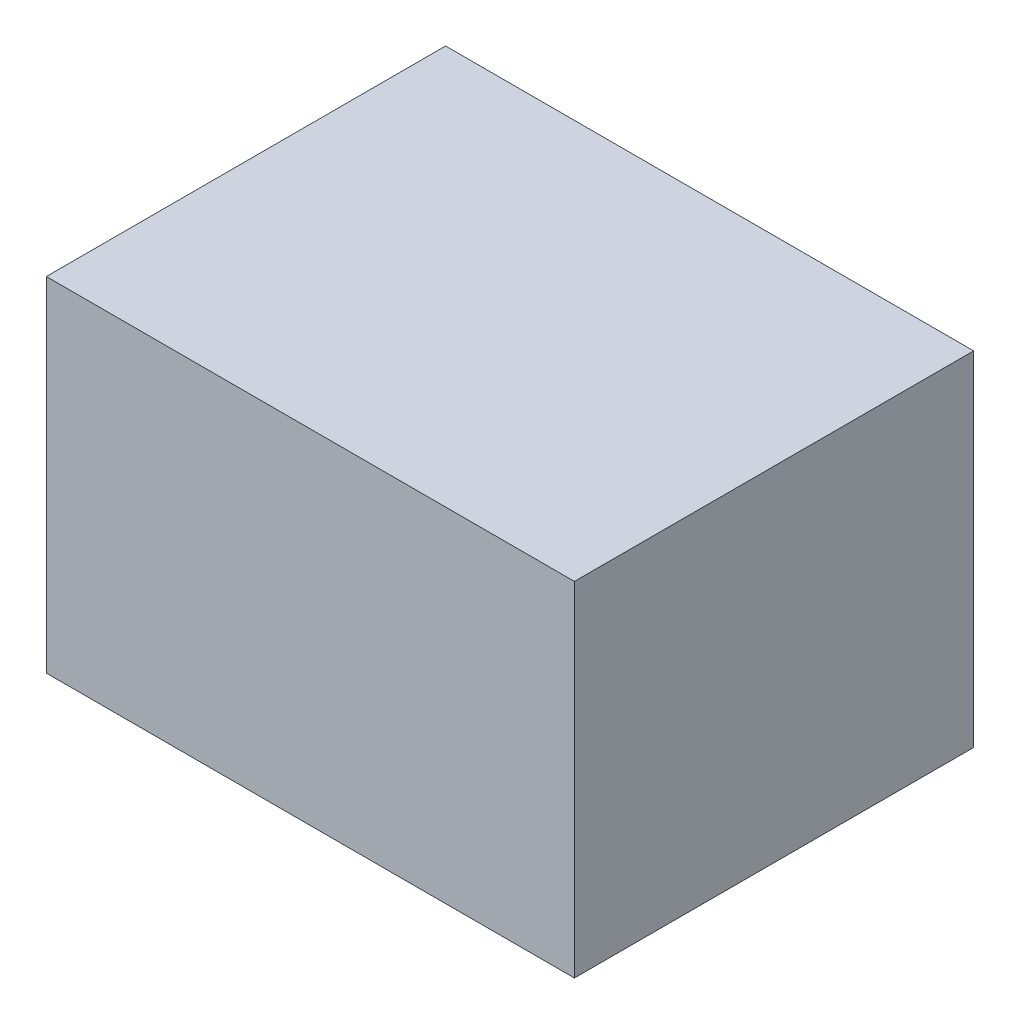
ISO-10303-21;
HEADER;
FILE_DESCRIPTION(('STEP AP214'),'2;1');
FILE_NAME('part.step','',(''),(''),'','','');
FILE_SCHEMA(('AUTOMOTIVE_DESIGN { 1 0 10303 214 1 1 1 1 }'));
ENDSEC;
DATA;
#1=APPLICATION_CONTEXT('core data for automotive mechanical design processes');
#2=APPLICATION_PROTOCOL_DEFINITION('international standard','automotive_design',2000,#1);
#3=PRODUCT_CONTEXT('',#1,'mechanical');
#4=PRODUCT('Part','Part','',(#3));
#5=PRODUCT_RELATED_PRODUCT_CATEGORY('part','',(#4));
#6=PRODUCT_DEFINITION_FORMATION('','',#4);
#7=PRODUCT_DEFINITION_CONTEXT('part definition',#1,'design');
#8=PRODUCT_DEFINITION('design','',#6,#7);
#9=PRODUCT_DEFINITION_SHAPE('','',#8);
#10=(LENGTH_UNIT() NAMED_UNIT(*) SI_UNIT(.MILLI.,.METRE.));
#11=(NAMED_UNIT(*) PLANE_ANGLE_UNIT() SI_UNIT($,.RADIAN.));
#12=(NAMED_UNIT(*) SI_UNIT($,.STERADIAN.) SOLID_ANGLE_UNIT());
#13=UNCERTAINTY_MEASURE_WITH_UNIT(LENGTH_MEASURE(1.E-05),#10,'distance_accuracy_value','');
#14=(GEOMETRIC_REPRESENTATION_CONTEXT(3) GLOBAL_UNCERTAINTY_ASSIGNED_CONTEXT((#13)) GLOBAL_UNIT_ASSIGNED_CONTEXT((#10,
#11,#12)) REPRESENTATION_CONTEXT('',''));
#15=CARTESIAN_POINT('',(0.,0.,0.));
#16=DIRECTION('',(0.,0.,1.));
#17=DIRECTION('',(1.,0.,0.));
#18=AXIS2_PLACEMENT_3D('',#15,#16,#17);
#19=CARTESIAN_POINT('',(1548.06985255528,1007.92203631971,1181.1));
#20=DIRECTION('',(1.,0.,0.));
#21=DIRECTION('',(0.,1.,0.));
#22=AXIS2_PLACEMENT_3D('',#19,#20,#21);
#23=PLANE('',#22);
#24=DIRECTION('',(0.,-1.,0.));
#25=VECTOR('',#24,1.);
#26=CARTESIAN_POINT('',(1548.06985255528,1007.92203631971,0.));
#27=LINE('',#26,#25);
#28=CARTESIAN_POINT('',(1548.06985255528,1007.92203631971,0.));
#29=VERTEX_POINT('',#28);
#30=CARTESIAN_POINT('',(1548.06985255528,-8.07796368029405,0.));
#31=VERTEX_POINT('',#30);
#32=EDGE_CURVE('E122',#29,#31,#27,.T.);
#33=ORIENTED_EDGE('',*,*,#32,.F.);
#34=DIRECTION('',(0.,0.,-1.));
#35=VECTOR('',#34,1.);
#36=CARTESIAN_POINT('',(1548.06985255528,1007.92203631971,1181.1));
#37=LINE('',#36,#35);
#38=CARTESIAN_POINT('',(1548.06985255528,1007.92203631971,1181.1));
#39=VERTEX_POINT('',#38);
#40=EDGE_CURVE('E11',#39,#29,#37,.T.);
#41=ORIENTED_EDGE('',*,*,#40,.F.);
#42=DIRECTION('',(0.,-1.,0.));
#43=VECTOR('',#42,1.);
#44=CARTESIAN_POINT('',(1548.06985255528,1007.92203631971,1181.1));
#45=LINE('',#44,#43);
#46=CARTESIAN_POINT('',(1548.06985255528,-8.07796368029405,1181.1));
#47=VERTEX_POINT('',#46);
#48=EDGE_CURVE('E115',#39,#47,#45,.T.);
#49=ORIENTED_EDGE('',*,*,#48,.T.);
#50=DIRECTION('',(0.,0.,-1.));
#51=VECTOR('',#50,1.);
#52=CARTESIAN_POINT('',(1548.06985255528,-8.07796368029405,1181.1));
#53=LINE('',#52,#51);
#54=EDGE_CURVE('E54',#47,#31,#53,.T.);
#55=ORIENTED_EDGE('',*,*,#54,.T.);
#56=EDGE_LOOP('',(#33,#41,#49,#55));
#57=FACE_BOUND('',#56,.T.);
#58=ADVANCED_FACE('F51',(#57),#23,.T.);
#59=CARTESIAN_POINT('',(1548.06985255528,1007.92203631971,1181.1));
#60=DIRECTION('',(0.,-1.,0.));
#61=DIRECTION('',(1.,0.,0.));
#62=AXIS2_PLACEMENT_3D('',#59,#60,#61);
#63=PLANE('',#62);
#64=DIRECTION('',(-1.,0.,0.));
#65=VECTOR('',#64,1.);
#66=CARTESIAN_POINT('',(1548.06985255528,1007.92203631971,0.));
#67=LINE('',#66,#65);
#68=CARTESIAN_POINT('',(-14.0301474447215,1007.92203631971,0.));
#69=VERTEX_POINT('',#68);
#70=EDGE_CURVE('E85',#29,#69,#67,.T.);
#71=ORIENTED_EDGE('',*,*,#70,.T.);
#72=DIRECTION('',(0.,0.,-1.));
#73=VECTOR('',#72,1.);
#74=CARTESIAN_POINT('',(-14.0301474447215,1007.92203631971,1181.1));
#75=LINE('',#74,#73);
#76=CARTESIAN_POINT('',(-14.0301474447215,1007.92203631971,1181.1));
#77=VERTEX_POINT('',#76);
#78=EDGE_CURVE('E61',#77,#69,#75,.T.);
#79=ORIENTED_EDGE('',*,*,#78,.F.);
#80=DIRECTION('',(-1.,0.,0.));
#81=VECTOR('',#80,1.);
#82=CARTESIAN_POINT('',(1548.06985255528,1007.92203631971,1181.1));
#83=LINE('',#82,#81);
#84=EDGE_CURVE('E102',#39,#77,#83,.T.);
#85=ORIENTED_EDGE('',*,*,#84,.F.);
#86=ORIENTED_EDGE('',*,*,#40,.T.);
#87=EDGE_LOOP('',(#71,#79,#85,#86));
#88=FACE_BOUND('',#87,.T.);
#89=ADVANCED_FACE('F138',(#88),#63,.F.);
#90=CARTESIAN_POINT('',(-14.0301474447215,1007.92203631971,1181.1));
#91=DIRECTION('',(1.,0.,0.));
#92=DIRECTION('',(0.,1.,0.));
#93=AXIS2_PLACEMENT_3D('',#90,#91,#92);
#94=PLANE('',#93);
#95=DIRECTION('',(0.,-1.,0.));
#96=VECTOR('',#95,1.);
#97=CARTESIAN_POINT('',(-14.0301474447215,1007.92203631971,0.));
#98=LINE('',#97,#96);
#99=CARTESIAN_POINT('',(-14.0301474447216,-8.07796368029424,0.));
#100=VERTEX_POINT('',#99);
#101=EDGE_CURVE('E110',#69,#100,#98,.T.);
#102=ORIENTED_EDGE('',*,*,#101,.T.);
#103=DIRECTION('',(0.,0.,-1.));
#104=VECTOR('',#103,1.);
#105=CARTESIAN_POINT('',(-14.0301474447216,-8.07796368029424,1181.1));
#106=LINE('',#105,#104);
#107=CARTESIAN_POINT('',(-14.0301474447216,-8.07796368029424,1181.1));
#108=VERTEX_POINT('',#107);
#109=EDGE_CURVE('E107',#108,#100,#106,.T.);
#110=ORIENTED_EDGE('',*,*,#109,.F.);
#111=DIRECTION('',(0.,-1.,0.));
#112=VECTOR('',#111,1.);
#113=CARTESIAN_POINT('',(-14.0301474447215,1007.92203631971,1181.1));
#114=LINE('',#113,#112);
#115=EDGE_CURVE('E97',#77,#108,#114,.T.);
#116=ORIENTED_EDGE('',*,*,#115,.F.);
#117=ORIENTED_EDGE('',*,*,#78,.T.);
#118=EDGE_LOOP('',(#102,#110,#116,#117));
#119=FACE_BOUND('',#118,.T.);
#120=ADVANCED_FACE('F108',(#119),#94,.F.);
#121=CARTESIAN_POINT('',(1548.06985255528,-8.07796368029405,1181.1));
#122=DIRECTION('',(0.,-1.,0.));
#123=DIRECTION('',(1.,0.,0.));
#124=AXIS2_PLACEMENT_3D('',#121,#122,#123);
#125=PLANE('',#124);
#126=DIRECTION('',(-1.,0.,0.));
#127=VECTOR('',#126,1.);
#128=CARTESIAN_POINT('',(1548.06985255528,-8.07796368029405,0.));
#129=LINE('',#128,#127);
#130=EDGE_CURVE('E126',#31,#100,#129,.T.);
#131=ORIENTED_EDGE('',*,*,#130,.F.);
#132=ORIENTED_EDGE('',*,*,#54,.F.);
#133=DIRECTION('',(-1.,0.,0.));
#134=VECTOR('',#133,1.);
#135=CARTESIAN_POINT('',(1548.06985255528,-8.07796368029405,1181.1));
#136=LINE('',#135,#134);
#137=EDGE_CURVE('E101',#47,#108,#136,.T.);
#138=ORIENTED_EDGE('',*,*,#137,.T.);
#139=ORIENTED_EDGE('',*,*,#109,.T.);
#140=EDGE_LOOP('',(#131,#132,#138,#139));
#141=FACE_BOUND('',#140,.T.);
#142=ADVANCED_FACE('F113',(#141),#125,.T.);
#143=CARTESIAN_POINT('',(0.,0.,1181.1));
#144=DIRECTION('',(0.,0.,-1.));
#145=DIRECTION('',(-1.,0.,0.));
#146=AXIS2_PLACEMENT_3D('',#143,#144,#145);
#147=PLANE('',#146);
#148=ORIENTED_EDGE('',*,*,#48,.F.);
#149=ORIENTED_EDGE('',*,*,#84,.T.);
#150=ORIENTED_EDGE('',*,*,#115,.T.);
#151=ORIENTED_EDGE('',*,*,#137,.F.);
#152=EDGE_LOOP('',(#148,#149,#150,#151));
#153=FACE_BOUND('',#152,.T.);
#154=ADVANCED_FACE('F100',(#153),#147,.F.);
#155=CARTESIAN_POINT('',(0.,0.,0.));
#156=DIRECTION('',(0.,0.,-1.));
#157=DIRECTION('',(-1.,0.,0.));
#158=AXIS2_PLACEMENT_3D('',#155,#156,#157);
#159=PLANE('',#158);
#160=ORIENTED_EDGE('',*,*,#32,.T.);
#161=ORIENTED_EDGE('',*,*,#130,.T.);
#162=ORIENTED_EDGE('',*,*,#101,.F.);
#163=ORIENTED_EDGE('',*,*,#70,.F.);
#164=EDGE_LOOP('',(#160,#161,#162,#163));
#165=FACE_BOUND('',#164,.T.);
#166=ADVANCED_FACE('F135',(#165),#159,.T.);
#167=CLOSED_SHELL('',(#58,#89,#120,#142,#154,#166));
#168=MANIFOLD_SOLID_BREP('B2',#167);
#169=ADVANCED_BREP_SHAPE_REPRESENTATION('',(#18,#168),#14);
#170=SHAPE_DEFINITION_REPRESENTATION(#9,#169);
ENDSEC;
END-ISO-10303-21;
